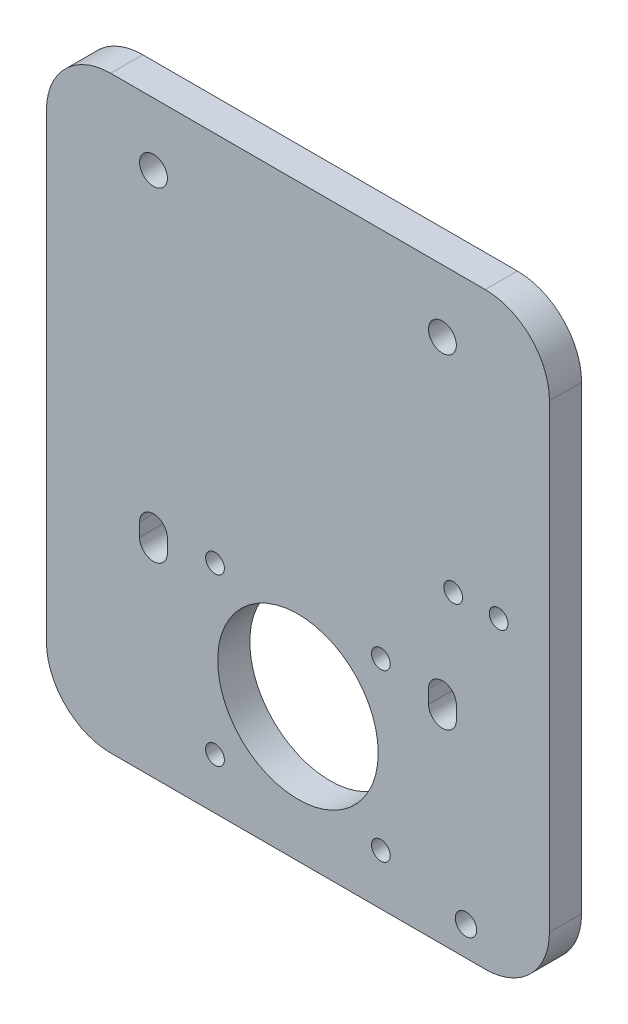
ISO-10303-21;
HEADER;
FILE_DESCRIPTION(('STEP AP214'),'2;1');
FILE_NAME('part.step','',(''),(''),'','','');
FILE_SCHEMA(('AUTOMOTIVE_DESIGN { 1 0 10303 214 1 1 1 1 }'));
ENDSEC;
DATA;
#1=APPLICATION_CONTEXT('core data for automotive mechanical design processes');
#2=APPLICATION_PROTOCOL_DEFINITION('international standard','automotive_design',2000,#1);
#3=PRODUCT_CONTEXT('',#1,'mechanical');
#4=PRODUCT('Part','Part','',(#3));
#5=PRODUCT_RELATED_PRODUCT_CATEGORY('part','',(#4));
#6=PRODUCT_DEFINITION_FORMATION('','',#4);
#7=PRODUCT_DEFINITION_CONTEXT('part definition',#1,'design');
#8=PRODUCT_DEFINITION('design','',#6,#7);
#9=PRODUCT_DEFINITION_SHAPE('','',#8);
#10=(LENGTH_UNIT() NAMED_UNIT(*) SI_UNIT(.MILLI.,.METRE.));
#11=(NAMED_UNIT(*) PLANE_ANGLE_UNIT() SI_UNIT($,.RADIAN.));
#12=(NAMED_UNIT(*) SI_UNIT($,.STERADIAN.) SOLID_ANGLE_UNIT());
#13=UNCERTAINTY_MEASURE_WITH_UNIT(LENGTH_MEASURE(1.E-05),#10,'distance_accuracy_value','');
#14=(GEOMETRIC_REPRESENTATION_CONTEXT(3) GLOBAL_UNCERTAINTY_ASSIGNED_CONTEXT((#13)) GLOBAL_UNIT_ASSIGNED_CONTEXT((#10,
#11,#12)) REPRESENTATION_CONTEXT('',''));
#15=CARTESIAN_POINT('',(0.,0.,0.));
#16=DIRECTION('',(0.,0.,1.));
#17=DIRECTION('',(1.,0.,0.));
#18=AXIS2_PLACEMENT_3D('',#15,#16,#17);
#19=CARTESIAN_POINT('',(27.,37.6,6.));
#20=DIRECTION('',(0.,0.,-1.));
#21=DIRECTION('',(-1.,0.,0.));
#22=AXIS2_PLACEMENT_3D('',#19,#20,#21);
#23=CYLINDRICAL_SURFACE('',#22,2.60000000000222);
#24=CARTESIAN_POINT('',(27.,37.6,0.));
#25=DIRECTION('',(0.,0.,1.));
#26=DIRECTION('',(1.,0.,0.));
#27=AXIS2_PLACEMENT_3D('',#24,#25,#26);
#28=CIRCLE('',#27,2.60000000000222);
#29=CARTESIAN_POINT('',(24.3999999999978,37.6,0.));
#30=VERTEX_POINT('',#29);
#31=CARTESIAN_POINT('',(29.6000000000022,37.6,0.));
#32=VERTEX_POINT('',#31);
#33=EDGE_CURVE('E241',#30,#32,#28,.T.);
#34=ORIENTED_EDGE('',*,*,#33,.F.);
#35=DIRECTION('',(0.,0.,-1.));
#36=VECTOR('',#35,1.);
#37=CARTESIAN_POINT('',(24.3999999999978,37.6,6.));
#38=LINE('',#37,#36);
#39=CARTESIAN_POINT('',(24.3999999999978,37.6,6.));
#40=VERTEX_POINT('',#39);
#41=EDGE_CURVE('E11',#40,#30,#38,.T.);
#42=ORIENTED_EDGE('',*,*,#41,.F.);
#43=CARTESIAN_POINT('',(27.,37.6,6.));
#44=DIRECTION('',(0.,0.,1.));
#45=DIRECTION('',(1.,0.,0.));
#46=AXIS2_PLACEMENT_3D('',#43,#44,#45);
#47=CIRCLE('',#46,2.60000000000222);
#48=CARTESIAN_POINT('',(29.6000000000022,37.6,6.));
#49=VERTEX_POINT('',#48);
#50=EDGE_CURVE('E175',#40,#49,#47,.T.);
#51=ORIENTED_EDGE('',*,*,#50,.T.);
#52=DIRECTION('',(0.,0.,-1.));
#53=VECTOR('',#52,1.);
#54=CARTESIAN_POINT('',(29.6000000000022,37.6,6.));
#55=LINE('',#54,#53);
#56=EDGE_CURVE('E55',#49,#32,#55,.T.);
#57=ORIENTED_EDGE('',*,*,#56,.T.);
#58=EDGE_LOOP('',(#34,#42,#51,#57));
#59=FACE_BOUND('',#58,.T.);
#60=ADVANCED_FACE('F36',(#59),#23,.F.);
#61=CARTESIAN_POINT('',(24.3999999999978,0.,6.));
#62=DIRECTION('',(1.,0.,0.));
#63=DIRECTION('',(0.,0.,-1.));
#64=AXIS2_PLACEMENT_3D('',#61,#62,#63);
#65=PLANE('',#64);
#66=DIRECTION('',(0.,-1.,0.));
#67=VECTOR('',#66,1.);
#68=CARTESIAN_POINT('',(24.3999999999978,0.,0.));
#69=LINE('',#68,#67);
#70=CARTESIAN_POINT('',(24.3999999999978,40.1000000000124,0.));
#71=VERTEX_POINT('',#70);
#72=EDGE_CURVE('E162',#71,#30,#69,.T.);
#73=ORIENTED_EDGE('',*,*,#72,.F.);
#74=DIRECTION('',(0.,0.,-1.));
#75=VECTOR('',#74,1.);
#76=CARTESIAN_POINT('',(24.3999999999978,40.1000000000124,6.));
#77=LINE('',#76,#75);
#78=CARTESIAN_POINT('',(24.3999999999978,40.1000000000124,6.));
#79=VERTEX_POINT('',#78);
#80=EDGE_CURVE('E46',#79,#71,#77,.T.);
#81=ORIENTED_EDGE('',*,*,#80,.F.);
#82=DIRECTION('',(0.,-1.,0.));
#83=VECTOR('',#82,1.);
#84=CARTESIAN_POINT('',(24.3999999999978,0.,6.));
#85=LINE('',#84,#83);
#86=EDGE_CURVE('E160',#79,#40,#85,.T.);
#87=ORIENTED_EDGE('',*,*,#86,.T.);
#88=ORIENTED_EDGE('',*,*,#41,.T.);
#89=EDGE_LOOP('',(#73,#81,#87,#88));
#90=FACE_BOUND('',#89,.T.);
#91=ADVANCED_FACE('F158',(#90),#65,.T.);
#92=CARTESIAN_POINT('',(27.,40.1000000000124,6.));
#93=DIRECTION('',(0.,0.,-1.));
#94=DIRECTION('',(-1.,0.,0.));
#95=AXIS2_PLACEMENT_3D('',#92,#93,#94);
#96=CYLINDRICAL_SURFACE('',#95,2.60000000000222);
#97=CARTESIAN_POINT('',(27.,40.1000000000124,0.));
#98=DIRECTION('',(0.,0.,1.));
#99=DIRECTION('',(1.,0.,0.));
#100=AXIS2_PLACEMENT_3D('',#97,#98,#99);
#101=CIRCLE('',#100,2.60000000000222);
#102=CARTESIAN_POINT('',(29.6000000000022,40.1000000000124,0.));
#103=VERTEX_POINT('',#102);
#104=EDGE_CURVE('E244',#71,#103,#101,.F.);
#105=ORIENTED_EDGE('',*,*,#104,.T.);
#106=DIRECTION('',(0.,0.,-1.));
#107=VECTOR('',#106,1.);
#108=CARTESIAN_POINT('',(29.6000000000022,40.1000000000124,6.));
#109=LINE('',#108,#107);
#110=CARTESIAN_POINT('',(29.6000000000022,40.1000000000124,6.));
#111=VERTEX_POINT('',#110);
#112=EDGE_CURVE('E105',#111,#103,#109,.T.);
#113=ORIENTED_EDGE('',*,*,#112,.F.);
#114=CARTESIAN_POINT('',(27.,40.1000000000124,6.));
#115=DIRECTION('',(0.,0.,1.));
#116=DIRECTION('',(1.,0.,0.));
#117=AXIS2_PLACEMENT_3D('',#114,#115,#116);
#118=CIRCLE('',#117,2.60000000000222);
#119=EDGE_CURVE('E166',#79,#111,#118,.F.);
#120=ORIENTED_EDGE('',*,*,#119,.F.);
#121=ORIENTED_EDGE('',*,*,#80,.T.);
#122=EDGE_LOOP('',(#105,#113,#120,#121));
#123=FACE_BOUND('',#122,.T.);
#124=ADVANCED_FACE('F167',(#123),#96,.F.);
#125=CARTESIAN_POINT('',(-35.,98.,6.));
#126=DIRECTION('',(0.,0.,-1.));
#127=DIRECTION('',(-1.,0.,0.));
#128=AXIS2_PLACEMENT_3D('',#125,#126,#127);
#129=CYLINDRICAL_SURFACE('',#128,12.);
#130=CARTESIAN_POINT('',(-35.,98.,0.));
#131=DIRECTION('',(0.,0.,1.));
#132=DIRECTION('',(1.,0.,0.));
#133=AXIS2_PLACEMENT_3D('',#130,#131,#132);
#134=CIRCLE('',#133,12.);
#135=CARTESIAN_POINT('',(-47.,98.,0.));
#136=VERTEX_POINT('',#135);
#137=CARTESIAN_POINT('',(-35.,110.,0.));
#138=VERTEX_POINT('',#137);
#139=EDGE_CURVE('E208',#136,#138,#134,.F.);
#140=ORIENTED_EDGE('',*,*,#139,.F.);
#141=DIRECTION('',(0.,0.,-1.));
#142=VECTOR('',#141,1.);
#143=CARTESIAN_POINT('',(-47.,98.,6.));
#144=LINE('',#143,#142);
#145=CARTESIAN_POINT('',(-47.,98.,6.));
#146=VERTEX_POINT('',#145);
#147=EDGE_CURVE('E257',#146,#136,#144,.T.);
#148=ORIENTED_EDGE('',*,*,#147,.F.);
#149=CARTESIAN_POINT('',(-35.,98.,6.));
#150=DIRECTION('',(0.,0.,1.));
#151=DIRECTION('',(1.,0.,0.));
#152=AXIS2_PLACEMENT_3D('',#149,#150,#151);
#153=CIRCLE('',#152,12.);
#154=CARTESIAN_POINT('',(-35.,110.,6.));
#155=VERTEX_POINT('',#154);
#156=EDGE_CURVE('E309',#146,#155,#153,.F.);
#157=ORIENTED_EDGE('',*,*,#156,.T.);
#158=DIRECTION('',(0.,0.,-1.));
#159=VECTOR('',#158,1.);
#160=CARTESIAN_POINT('',(-35.,110.,6.));
#161=LINE('',#160,#159);
#162=EDGE_CURVE('E259',#155,#138,#161,.T.);
#163=ORIENTED_EDGE('',*,*,#162,.T.);
#164=EDGE_LOOP('',(#140,#148,#157,#163));
#165=FACE_BOUND('',#164,.T.);
#166=ADVANCED_FACE('F406',(#165),#129,.T.);
#167=CARTESIAN_POINT('',(-47.,0.,6.));
#168=DIRECTION('',(-1.,0.,0.));
#169=DIRECTION('',(0.,-1.,0.));
#170=AXIS2_PLACEMENT_3D('',#167,#168,#169);
#171=PLANE('',#170);
#172=DIRECTION('',(0.,1.,0.));
#173=VECTOR('',#172,1.);
#174=CARTESIAN_POINT('',(-47.,0.,0.));
#175=LINE('',#174,#173);
#176=CARTESIAN_POINT('',(-47.,12.0000000000009,0.));
#177=VERTEX_POINT('',#176);
#178=EDGE_CURVE('E211',#177,#136,#175,.T.);
#179=ORIENTED_EDGE('',*,*,#178,.F.);
#180=DIRECTION('',(0.,0.,-1.));
#181=VECTOR('',#180,1.);
#182=CARTESIAN_POINT('',(-47.,12.0000000000009,6.));
#183=LINE('',#182,#181);
#184=CARTESIAN_POINT('',(-47.,12.0000000000009,6.));
#185=VERTEX_POINT('',#184);
#186=EDGE_CURVE('E271',#185,#177,#183,.T.);
#187=ORIENTED_EDGE('',*,*,#186,.F.);
#188=DIRECTION('',(0.,1.,0.));
#189=VECTOR('',#188,1.);
#190=CARTESIAN_POINT('',(-47.,0.,6.));
#191=LINE('',#190,#189);
#192=EDGE_CURVE('E312',#185,#146,#191,.T.);
#193=ORIENTED_EDGE('',*,*,#192,.T.);
#194=ORIENTED_EDGE('',*,*,#147,.T.);
#195=EDGE_LOOP('',(#179,#187,#193,#194));
#196=FACE_BOUND('',#195,.T.);
#197=ADVANCED_FACE('F402',(#196),#171,.T.);
#198=CARTESIAN_POINT('',(-35.,12.0000000000009,6.));
#199=DIRECTION('',(0.,0.,-1.));
#200=DIRECTION('',(-1.,0.,0.));
#201=AXIS2_PLACEMENT_3D('',#198,#199,#200);
#202=CYLINDRICAL_SURFACE('',#201,12.);
#203=CARTESIAN_POINT('',(-35.,12.0000000000009,0.));
#204=DIRECTION('',(0.,0.,1.));
#205=DIRECTION('',(1.,0.,0.));
#206=AXIS2_PLACEMENT_3D('',#203,#204,#205);
#207=CIRCLE('',#206,12.);
#208=CARTESIAN_POINT('',(-35.,8.88325627822381E-13,0.));
#209=VERTEX_POINT('',#208);
#210=EDGE_CURVE('E214',#177,#209,#207,.T.);
#211=ORIENTED_EDGE('',*,*,#210,.T.);
#212=DIRECTION('',(0.,0.,-1.));
#213=VECTOR('',#212,1.);
#214=CARTESIAN_POINT('',(-35.,8.88325627822381E-13,6.));
#215=LINE('',#214,#213);
#216=CARTESIAN_POINT('',(-35.,8.88325627822381E-13,6.));
#217=VERTEX_POINT('',#216);
#218=EDGE_CURVE('E269',#217,#209,#215,.T.);
#219=ORIENTED_EDGE('',*,*,#218,.F.);
#220=CARTESIAN_POINT('',(-35.,12.0000000000009,6.));
#221=DIRECTION('',(0.,0.,1.));
#222=DIRECTION('',(1.,0.,0.));
#223=AXIS2_PLACEMENT_3D('',#220,#221,#222);
#224=CIRCLE('',#223,12.);
#225=EDGE_CURVE('E315',#185,#217,#224,.T.);
#226=ORIENTED_EDGE('',*,*,#225,.F.);
#227=ORIENTED_EDGE('',*,*,#186,.T.);
#228=EDGE_LOOP('',(#211,#219,#226,#227));
#229=FACE_BOUND('',#228,.T.);
#230=ADVANCED_FACE('F398',(#229),#202,.T.);
#231=CARTESIAN_POINT('',(0.,8.88325627822381E-13,6.));
#232=DIRECTION('',(0.,-1.,0.));
#233=DIRECTION('',(0.,0.,-1.));
#234=AXIS2_PLACEMENT_3D('',#231,#232,#233);
#235=PLANE('',#234);
#236=DIRECTION('',(-1.,0.,0.));
#237=VECTOR('',#236,1.);
#238=CARTESIAN_POINT('',(0.,8.88325627822381E-13,0.));
#239=LINE('',#238,#237);
#240=CARTESIAN_POINT('',(35.,8.88325627822381E-13,0.));
#241=VERTEX_POINT('',#240);
#242=EDGE_CURVE('E217',#241,#209,#239,.T.);
#243=ORIENTED_EDGE('',*,*,#242,.F.);
#244=DIRECTION('',(0.,0.,-1.));
#245=VECTOR('',#244,1.);
#246=CARTESIAN_POINT('',(35.,8.88325627822381E-13,6.));
#247=LINE('',#246,#245);
#248=CARTESIAN_POINT('',(35.,8.88325627822381E-13,6.));
#249=VERTEX_POINT('',#248);
#250=EDGE_CURVE('E267',#249,#241,#247,.T.);
#251=ORIENTED_EDGE('',*,*,#250,.F.);
#252=DIRECTION('',(-1.,0.,0.));
#253=VECTOR('',#252,1.);
#254=CARTESIAN_POINT('',(0.,8.88325627822381E-13,6.));
#255=LINE('',#254,#253);
#256=EDGE_CURVE('E317',#249,#217,#255,.T.);
#257=ORIENTED_EDGE('',*,*,#256,.T.);
#258=ORIENTED_EDGE('',*,*,#218,.T.);
#259=EDGE_LOOP('',(#243,#251,#257,#258));
#260=FACE_BOUND('',#259,.T.);
#261=ADVANCED_FACE('F394',(#260),#235,.T.);
#262=CARTESIAN_POINT('',(35.,12.0000000000009,6.));
#263=DIRECTION('',(0.,0.,-1.));
#264=DIRECTION('',(-1.,0.,0.));
#265=AXIS2_PLACEMENT_3D('',#262,#263,#264);
#266=CYLINDRICAL_SURFACE('',#265,12.);
#267=CARTESIAN_POINT('',(35.,12.0000000000009,0.));
#268=DIRECTION('',(0.,0.,1.));
#269=DIRECTION('',(1.,0.,0.));
#270=AXIS2_PLACEMENT_3D('',#267,#268,#269);
#271=CIRCLE('',#270,12.);
#272=CARTESIAN_POINT('',(47.,12.0000000000009,0.));
#273=VERTEX_POINT('',#272);
#274=EDGE_CURVE('E220',#273,#241,#271,.F.);
#275=ORIENTED_EDGE('',*,*,#274,.F.);
#276=DIRECTION('',(0.,0.,-1.));
#277=VECTOR('',#276,1.);
#278=CARTESIAN_POINT('',(47.,12.0000000000009,6.));
#279=LINE('',#278,#277);
#280=CARTESIAN_POINT('',(47.,12.0000000000009,6.));
#281=VERTEX_POINT('',#280);
#282=EDGE_CURVE('E265',#281,#273,#279,.T.);
#283=ORIENTED_EDGE('',*,*,#282,.F.);
#284=CARTESIAN_POINT('',(35.,12.0000000000009,6.));
#285=DIRECTION('',(0.,0.,1.));
#286=DIRECTION('',(1.,0.,0.));
#287=AXIS2_PLACEMENT_3D('',#284,#285,#286);
#288=CIRCLE('',#287,12.);
#289=EDGE_CURVE('E320',#281,#249,#288,.F.);
#290=ORIENTED_EDGE('',*,*,#289,.T.);
#291=ORIENTED_EDGE('',*,*,#250,.T.);
#292=EDGE_LOOP('',(#275,#283,#290,#291));
#293=FACE_BOUND('',#292,.T.);
#294=ADVANCED_FACE('F390',(#293),#266,.T.);
#295=CARTESIAN_POINT('',(47.,0.,6.));
#296=DIRECTION('',(1.,0.,0.));
#297=DIRECTION('',(0.,0.,-1.));
#298=AXIS2_PLACEMENT_3D('',#295,#296,#297);
#299=PLANE('',#298);
#300=DIRECTION('',(0.,-1.,0.));
#301=VECTOR('',#300,1.);
#302=CARTESIAN_POINT('',(47.,0.,0.));
#303=LINE('',#302,#301);
#304=CARTESIAN_POINT('',(47.,98.,0.));
#305=VERTEX_POINT('',#304);
#306=EDGE_CURVE('E223',#305,#273,#303,.T.);
#307=ORIENTED_EDGE('',*,*,#306,.F.);
#308=DIRECTION('',(0.,0.,-1.));
#309=VECTOR('',#308,1.);
#310=CARTESIAN_POINT('',(47.,98.,6.));
#311=LINE('',#310,#309);
#312=CARTESIAN_POINT('',(47.,98.,6.));
#313=VERTEX_POINT('',#312);
#314=EDGE_CURVE('E263',#313,#305,#311,.T.);
#315=ORIENTED_EDGE('',*,*,#314,.F.);
#316=DIRECTION('',(0.,-1.,0.));
#317=VECTOR('',#316,1.);
#318=CARTESIAN_POINT('',(47.,0.,6.));
#319=LINE('',#318,#317);
#320=EDGE_CURVE('E323',#313,#281,#319,.T.);
#321=ORIENTED_EDGE('',*,*,#320,.T.);
#322=ORIENTED_EDGE('',*,*,#282,.T.);
#323=EDGE_LOOP('',(#307,#315,#321,#322));
#324=FACE_BOUND('',#323,.T.);
#325=ADVANCED_FACE('F386',(#324),#299,.T.);
#326=CARTESIAN_POINT('',(35.,98.,6.));
#327=DIRECTION('',(0.,0.,-1.));
#328=DIRECTION('',(-1.,0.,0.));
#329=AXIS2_PLACEMENT_3D('',#326,#327,#328);
#330=CYLINDRICAL_SURFACE('',#329,12.);
#331=CARTESIAN_POINT('',(35.,98.,0.));
#332=DIRECTION('',(0.,0.,1.));
#333=DIRECTION('',(1.,0.,0.));
#334=AXIS2_PLACEMENT_3D('',#331,#332,#333);
#335=CIRCLE('',#334,12.);
#336=CARTESIAN_POINT('',(35.,110.,0.));
#337=VERTEX_POINT('',#336);
#338=EDGE_CURVE('E226',#337,#305,#335,.F.);
#339=ORIENTED_EDGE('',*,*,#338,.F.);
#340=DIRECTION('',(0.,0.,-1.));
#341=VECTOR('',#340,1.);
#342=CARTESIAN_POINT('',(35.,110.,6.));
#343=LINE('',#342,#341);
#344=CARTESIAN_POINT('',(35.,110.,6.));
#345=VERTEX_POINT('',#344);
#346=EDGE_CURVE('E261',#345,#337,#343,.T.);
#347=ORIENTED_EDGE('',*,*,#346,.F.);
#348=CARTESIAN_POINT('',(35.,98.,6.));
#349=DIRECTION('',(0.,0.,1.));
#350=DIRECTION('',(1.,0.,0.));
#351=AXIS2_PLACEMENT_3D('',#348,#349,#350);
#352=CIRCLE('',#351,12.);
#353=EDGE_CURVE('E326',#345,#313,#352,.F.);
#354=ORIENTED_EDGE('',*,*,#353,.T.);
#355=ORIENTED_EDGE('',*,*,#314,.T.);
#356=EDGE_LOOP('',(#339,#347,#354,#355));
#357=FACE_BOUND('',#356,.T.);
#358=ADVANCED_FACE('F383',(#357),#330,.T.);
#359=CARTESIAN_POINT('',(-27.,40.1000000000124,6.));
#360=DIRECTION('',(0.,0.,-1.));
#361=DIRECTION('',(-1.,0.,0.));
#362=AXIS2_PLACEMENT_3D('',#359,#360,#361);
#363=CYLINDRICAL_SURFACE('',#362,2.60000000000222);
#364=CARTESIAN_POINT('',(-27.,40.1000000000124,0.));
#365=DIRECTION('',(0.,0.,1.));
#366=DIRECTION('',(1.,0.,0.));
#367=AXIS2_PLACEMENT_3D('',#364,#365,#366);
#368=CIRCLE('',#367,2.60000000000222);
#369=CARTESIAN_POINT('',(-24.3999999999978,40.1000000000124,0.));
#370=VERTEX_POINT('',#369);
#371=CARTESIAN_POINT('',(-29.6000000000022,40.1000000000124,0.));
#372=VERTEX_POINT('',#371);
#373=EDGE_CURVE('E189',#370,#372,#368,.T.);
#374=ORIENTED_EDGE('',*,*,#373,.F.);
#375=DIRECTION('',(0.,0.,-1.));
#376=VECTOR('',#375,1.);
#377=CARTESIAN_POINT('',(-24.3999999999978,40.1000000000124,6.));
#378=LINE('',#377,#376);
#379=CARTESIAN_POINT('',(-24.3999999999978,40.1000000000124,6.));
#380=VERTEX_POINT('',#379);
#381=EDGE_CURVE('E40',#380,#370,#378,.T.);
#382=ORIENTED_EDGE('',*,*,#381,.F.);
#383=CARTESIAN_POINT('',(-27.,40.1000000000124,6.));
#384=DIRECTION('',(0.,0.,1.));
#385=DIRECTION('',(1.,0.,0.));
#386=AXIS2_PLACEMENT_3D('',#383,#384,#385);
#387=CIRCLE('',#386,2.60000000000222);
#388=CARTESIAN_POINT('',(-29.6000000000022,40.1000000000124,6.));
#389=VERTEX_POINT('',#388);
#390=EDGE_CURVE('E255',#380,#389,#387,.T.);
#391=ORIENTED_EDGE('',*,*,#390,.T.);
#392=DIRECTION('',(0.,0.,-1.));
#393=VECTOR('',#392,1.);
#394=CARTESIAN_POINT('',(-29.6000000000022,40.1000000000124,6.));
#395=LINE('',#394,#393);
#396=EDGE_CURVE('E188',#389,#372,#395,.T.);
#397=ORIENTED_EDGE('',*,*,#396,.T.);
#398=EDGE_LOOP('',(#374,#382,#391,#397));
#399=FACE_BOUND('',#398,.T.);
#400=ADVANCED_FACE('F38',(#399),#363,.F.);
#401=CARTESIAN_POINT('',(-24.3999999999978,0.,6.));
#402=DIRECTION('',(-1.,0.,0.));
#403=DIRECTION('',(0.,0.,1.));
#404=AXIS2_PLACEMENT_3D('',#401,#402,#403);
#405=PLANE('',#404);
#406=DIRECTION('',(0.,1.,0.));
#407=VECTOR('',#406,1.);
#408=CARTESIAN_POINT('',(-24.3999999999978,0.,0.));
#409=LINE('',#408,#407);
#410=CARTESIAN_POINT('',(-24.3999999999978,37.6,0.));
#411=VERTEX_POINT('',#410);
#412=EDGE_CURVE('E192',#411,#370,#409,.T.);
#413=ORIENTED_EDGE('',*,*,#412,.F.);
#414=DIRECTION('',(0.,0.,-1.));
#415=VECTOR('',#414,1.);
#416=CARTESIAN_POINT('',(-24.3999999999978,37.6,6.));
#417=LINE('',#416,#415);
#418=CARTESIAN_POINT('',(-24.3999999999978,37.6,6.));
#419=VERTEX_POINT('',#418);
#420=EDGE_CURVE('E276',#419,#411,#417,.T.);
#421=ORIENTED_EDGE('',*,*,#420,.F.);
#422=DIRECTION('',(0.,1.,0.));
#423=VECTOR('',#422,1.);
#424=CARTESIAN_POINT('',(-24.3999999999978,0.,6.));
#425=LINE('',#424,#423);
#426=EDGE_CURVE('E285',#419,#380,#425,.T.);
#427=ORIENTED_EDGE('',*,*,#426,.T.);
#428=ORIENTED_EDGE('',*,*,#381,.T.);
#429=EDGE_LOOP('',(#413,#421,#427,#428));
#430=FACE_BOUND('',#429,.T.);
#431=ADVANCED_FACE('F283',(#430),#405,.T.);
#432=CARTESIAN_POINT('',(-27.,37.6,6.));
#433=DIRECTION('',(0.,0.,-1.));
#434=DIRECTION('',(-1.,0.,0.));
#435=AXIS2_PLACEMENT_3D('',#432,#433,#434);
#436=CYLINDRICAL_SURFACE('',#435,2.60000000000222);
#437=CARTESIAN_POINT('',(-27.,37.6,0.));
#438=DIRECTION('',(0.,0.,1.));
#439=DIRECTION('',(1.,0.,0.));
#440=AXIS2_PLACEMENT_3D('',#437,#438,#439);
#441=CIRCLE('',#440,2.60000000000222);
#442=CARTESIAN_POINT('',(-29.6000000000022,37.6,0.));
#443=VERTEX_POINT('',#442);
#444=EDGE_CURVE('E196',#411,#443,#441,.F.);
#445=ORIENTED_EDGE('',*,*,#444,.T.);
#446=DIRECTION('',(0.,0.,-1.));
#447=VECTOR('',#446,1.);
#448=CARTESIAN_POINT('',(-29.6000000000022,37.6,6.));
#449=LINE('',#448,#447);
#450=CARTESIAN_POINT('',(-29.6000000000022,37.6,6.));
#451=VERTEX_POINT('',#450);
#452=EDGE_CURVE('E275',#451,#443,#449,.T.);
#453=ORIENTED_EDGE('',*,*,#452,.F.);
#454=CARTESIAN_POINT('',(-27.,37.6,6.));
#455=DIRECTION('',(0.,0.,1.));
#456=DIRECTION('',(1.,0.,0.));
#457=AXIS2_PLACEMENT_3D('',#454,#455,#456);
#458=CIRCLE('',#457,2.60000000000222);
#459=EDGE_CURVE('E293',#419,#451,#458,.F.);
#460=ORIENTED_EDGE('',*,*,#459,.F.);
#461=ORIENTED_EDGE('',*,*,#420,.T.);
#462=EDGE_LOOP('',(#445,#453,#460,#461));
#463=FACE_BOUND('',#462,.T.);
#464=ADVANCED_FACE('F291',(#463),#436,.F.);
#465=CARTESIAN_POINT('',(27.,98.3000000000124,6.));
#466=DIRECTION('',(0.,0.,-1.));
#467=DIRECTION('',(-1.,0.,0.));
#468=AXIS2_PLACEMENT_3D('',#465,#466,#467);
#469=CYLINDRICAL_SURFACE('',#468,2.6);
#470=CARTESIAN_POINT('',(27.,98.3000000000124,6.));
#471=DIRECTION('',(0.,0.,1.));
#472=DIRECTION('',(1.,0.,0.));
#473=AXIS2_PLACEMENT_3D('',#470,#471,#472);
#474=CIRCLE('',#473,2.6);
#475=CARTESIAN_POINT('',(29.6,98.3000000000124,6.));
#476=VERTEX_POINT('',#475);
#477=EDGE_CURVE('E182',#476,#476,#474,.T.);
#478=ORIENTED_EDGE('',*,*,#477,.T.);
#479=EDGE_LOOP('',(#478));
#480=FACE_BOUND('',#479,.T.);
#481=CARTESIAN_POINT('',(27.,98.3000000000124,0.));
#482=DIRECTION('',(0.,0.,1.));
#483=DIRECTION('',(1.,0.,0.));
#484=AXIS2_PLACEMENT_3D('',#481,#482,#483);
#485=CIRCLE('',#484,2.6);
#486=CARTESIAN_POINT('',(29.6,98.3000000000124,0.));
#487=VERTEX_POINT('',#486);
#488=EDGE_CURVE('E249',#487,#487,#485,.T.);
#489=ORIENTED_EDGE('',*,*,#488,.F.);
#490=EDGE_LOOP('',(#489));
#491=FACE_BOUND('',#490,.T.);
#492=ADVANCED_FACE('F421',(#480,#491),#469,.F.);
#493=CARTESIAN_POINT('',(29.6000000000022,0.,6.));
#494=DIRECTION('',(-1.,0.,0.));
#495=DIRECTION('',(0.,0.,1.));
#496=AXIS2_PLACEMENT_3D('',#493,#494,#495);
#497=PLANE('',#496);
#498=DIRECTION('',(0.,1.,0.));
#499=VECTOR('',#498,1.);
#500=CARTESIAN_POINT('',(29.6000000000022,0.,0.));
#501=LINE('',#500,#499);
#502=EDGE_CURVE('E246',#32,#103,#501,.T.);
#503=ORIENTED_EDGE('',*,*,#502,.F.);
#504=ORIENTED_EDGE('',*,*,#56,.F.);
#505=DIRECTION('',(0.,1.,0.));
#506=VECTOR('',#505,1.);
#507=CARTESIAN_POINT('',(29.6000000000022,0.,6.));
#508=LINE('',#507,#506);
#509=EDGE_CURVE('E170',#49,#111,#508,.T.);
#510=ORIENTED_EDGE('',*,*,#509,.T.);
#511=ORIENTED_EDGE('',*,*,#112,.T.);
#512=EDGE_LOOP('',(#503,#504,#510,#511));
#513=FACE_BOUND('',#512,.T.);
#514=ADVANCED_FACE('F370',(#513),#497,.T.);
#515=CARTESIAN_POINT('',(0.,25.,6.));
#516=DIRECTION('',(0.,0.,-1.));
#517=DIRECTION('',(-1.,0.,0.));
#518=AXIS2_PLACEMENT_3D('',#515,#516,#517);
#519=CYLINDRICAL_SURFACE('',#518,15.);
#520=CARTESIAN_POINT('',(0.,25.,6.));
#521=DIRECTION('',(0.,0.,1.));
#522=DIRECTION('',(1.,0.,0.));
#523=AXIS2_PLACEMENT_3D('',#520,#521,#522);
#524=CIRCLE('',#523,15.);
#525=CARTESIAN_POINT('',(15.,25.,6.));
#526=VERTEX_POINT('',#525);
#527=EDGE_CURVE('E177',#526,#526,#524,.T.);
#528=ORIENTED_EDGE('',*,*,#527,.T.);
#529=EDGE_LOOP('',(#528));
#530=FACE_BOUND('',#529,.T.);
#531=CARTESIAN_POINT('',(0.,25.,0.));
#532=DIRECTION('',(0.,0.,1.));
#533=DIRECTION('',(1.,0.,0.));
#534=AXIS2_PLACEMENT_3D('',#531,#532,#533);
#535=CIRCLE('',#534,15.);
#536=CARTESIAN_POINT('',(15.,25.,0.));
#537=VERTEX_POINT('',#536);
#538=EDGE_CURVE('E238',#537,#537,#535,.T.);
#539=ORIENTED_EDGE('',*,*,#538,.F.);
#540=EDGE_LOOP('',(#539));
#541=FACE_BOUND('',#540,.T.);
#542=ADVANCED_FACE('F340',(#530,#541),#519,.F.);
#543=CARTESIAN_POINT('',(15.5,40.5,6.));
#544=DIRECTION('',(0.,0.,-1.));
#545=DIRECTION('',(-1.,0.,0.));
#546=AXIS2_PLACEMENT_3D('',#543,#544,#545);
#547=CYLINDRICAL_SURFACE('',#546,1.75);
#548=CARTESIAN_POINT('',(15.5,40.5,6.));
#549=DIRECTION('',(0.,0.,1.));
#550=DIRECTION('',(1.,0.,0.));
#551=AXIS2_PLACEMENT_3D('',#548,#549,#550);
#552=CIRCLE('',#551,1.75);
#553=CARTESIAN_POINT('',(17.25,40.5,6.));
#554=VERTEX_POINT('',#553);
#555=EDGE_CURVE('E335',#554,#554,#552,.F.);
#556=ORIENTED_EDGE('',*,*,#555,.F.);
#557=EDGE_LOOP('',(#556));
#558=FACE_BOUND('',#557,.T.);
#559=CARTESIAN_POINT('',(15.5,40.5,0.));
#560=DIRECTION('',(0.,0.,1.));
#561=DIRECTION('',(1.,0.,0.));
#562=AXIS2_PLACEMENT_3D('',#559,#560,#561);
#563=CIRCLE('',#562,1.75);
#564=CARTESIAN_POINT('',(17.25,40.5,0.));
#565=VERTEX_POINT('',#564);
#566=EDGE_CURVE('E235',#565,#565,#563,.F.);
#567=ORIENTED_EDGE('',*,*,#566,.T.);
#568=EDGE_LOOP('',(#567));
#569=FACE_BOUND('',#568,.T.);
#570=ADVANCED_FACE('F369',(#558,#569),#547,.F.);
#571=CARTESIAN_POINT('',(15.5,9.49999999999999,6.));
#572=DIRECTION('',(0.,0.,-1.));
#573=DIRECTION('',(-1.,0.,0.));
#574=AXIS2_PLACEMENT_3D('',#571,#572,#573);
#575=CYLINDRICAL_SURFACE('',#574,1.75);
#576=CARTESIAN_POINT('',(15.5,9.49999999999999,6.));
#577=DIRECTION('',(0.,0.,1.));
#578=DIRECTION('',(1.,0.,0.));
#579=AXIS2_PLACEMENT_3D('',#576,#577,#578);
#580=CIRCLE('',#579,1.75);
#581=CARTESIAN_POINT('',(17.25,9.49999999999999,6.));
#582=VERTEX_POINT('',#581);
#583=EDGE_CURVE('E332',#582,#582,#580,.T.);
#584=ORIENTED_EDGE('',*,*,#583,.T.);
#585=EDGE_LOOP('',(#584));
#586=FACE_BOUND('',#585,.T.);
#587=CARTESIAN_POINT('',(15.5,9.49999999999999,0.));
#588=DIRECTION('',(0.,0.,1.));
#589=DIRECTION('',(1.,0.,0.));
#590=AXIS2_PLACEMENT_3D('',#587,#588,#589);
#591=CIRCLE('',#590,1.75);
#592=CARTESIAN_POINT('',(17.25,9.49999999999999,0.));
#593=VERTEX_POINT('',#592);
#594=EDGE_CURVE('E232',#593,#593,#591,.T.);
#595=ORIENTED_EDGE('',*,*,#594,.F.);
#596=EDGE_LOOP('',(#595));
#597=FACE_BOUND('',#596,.T.);
#598=ADVANCED_FACE('F373',(#586,#597),#575,.F.);
#599=CARTESIAN_POINT('',(0.,110.,6.));
#600=DIRECTION('',(0.,1.,0.));
#601=DIRECTION('',(0.,0.,1.));
#602=AXIS2_PLACEMENT_3D('',#599,#600,#601);
#603=PLANE('',#602);
#604=DIRECTION('',(1.,0.,0.));
#605=VECTOR('',#604,1.);
#606=CARTESIAN_POINT('',(0.,110.,0.));
#607=LINE('',#606,#605);
#608=EDGE_CURVE('E229',#138,#337,#607,.T.);
#609=ORIENTED_EDGE('',*,*,#608,.F.);
#610=ORIENTED_EDGE('',*,*,#162,.F.);
#611=DIRECTION('',(1.,0.,0.));
#612=VECTOR('',#611,1.);
#613=CARTESIAN_POINT('',(0.,110.,6.));
#614=LINE('',#613,#612);
#615=EDGE_CURVE('E329',#155,#345,#614,.T.);
#616=ORIENTED_EDGE('',*,*,#615,.T.);
#617=ORIENTED_EDGE('',*,*,#346,.T.);
#618=EDGE_LOOP('',(#609,#610,#616,#617));
#619=FACE_BOUND('',#618,.T.);
#620=ADVANCED_FACE('F377',(#619),#603,.T.);
#621=CARTESIAN_POINT('',(-15.5,40.5,6.));
#622=DIRECTION('',(0.,0.,-1.));
#623=DIRECTION('',(-1.,0.,0.));
#624=AXIS2_PLACEMENT_3D('',#621,#622,#623);
#625=CYLINDRICAL_SURFACE('',#624,1.75);
#626=CARTESIAN_POINT('',(-15.5,40.5,6.));
#627=DIRECTION('',(0.,0.,1.));
#628=DIRECTION('',(1.,0.,0.));
#629=AXIS2_PLACEMENT_3D('',#626,#627,#628);
#630=CIRCLE('',#629,1.75);
#631=CARTESIAN_POINT('',(-13.75,40.5,6.));
#632=VERTEX_POINT('',#631);
#633=EDGE_CURVE('E302',#632,#632,#630,.T.);
#634=ORIENTED_EDGE('',*,*,#633,.T.);
#635=EDGE_LOOP('',(#634));
#636=FACE_BOUND('',#635,.T.);
#637=CARTESIAN_POINT('',(-15.5,40.5,0.));
#638=DIRECTION('',(0.,0.,1.));
#639=DIRECTION('',(1.,0.,0.));
#640=AXIS2_PLACEMENT_3D('',#637,#638,#639);
#641=CIRCLE('',#640,1.75);
#642=CARTESIAN_POINT('',(-13.75,40.5,0.));
#643=VERTEX_POINT('',#642);
#644=EDGE_CURVE('E205',#643,#643,#641,.T.);
#645=ORIENTED_EDGE('',*,*,#644,.F.);
#646=EDGE_LOOP('',(#645));
#647=FACE_BOUND('',#646,.T.);
#648=ADVANCED_FACE('F381',(#636,#647),#625,.F.);
#649=CARTESIAN_POINT('',(-15.5,9.49999999999998,6.));
#650=DIRECTION('',(0.,0.,-1.));
#651=DIRECTION('',(-1.,0.,0.));
#652=AXIS2_PLACEMENT_3D('',#649,#650,#651);
#653=CYLINDRICAL_SURFACE('',#652,1.75);
#654=CARTESIAN_POINT('',(-15.5,9.49999999999998,6.));
#655=DIRECTION('',(0.,0.,1.));
#656=DIRECTION('',(1.,0.,0.));
#657=AXIS2_PLACEMENT_3D('',#654,#655,#656);
#658=CIRCLE('',#657,1.75);
#659=CARTESIAN_POINT('',(-13.75,9.49999999999998,6.));
#660=VERTEX_POINT('',#659);
#661=EDGE_CURVE('E299',#660,#660,#658,.F.);
#662=ORIENTED_EDGE('',*,*,#661,.F.);
#663=EDGE_LOOP('',(#662));
#664=FACE_BOUND('',#663,.T.);
#665=CARTESIAN_POINT('',(-15.5,9.49999999999998,0.));
#666=DIRECTION('',(0.,0.,1.));
#667=DIRECTION('',(1.,0.,0.));
#668=AXIS2_PLACEMENT_3D('',#665,#666,#667);
#669=CIRCLE('',#668,1.75);
#670=CARTESIAN_POINT('',(-13.75,9.49999999999998,0.));
#671=VERTEX_POINT('',#670);
#672=EDGE_CURVE('E202',#671,#671,#669,.F.);
#673=ORIENTED_EDGE('',*,*,#672,.T.);
#674=EDGE_LOOP('',(#673));
#675=FACE_BOUND('',#674,.T.);
#676=ADVANCED_FACE('F413',(#664,#675),#653,.F.);
#677=CARTESIAN_POINT('',(-29.6000000000022,0.,6.));
#678=DIRECTION('',(1.,0.,0.));
#679=DIRECTION('',(0.,0.,-1.));
#680=AXIS2_PLACEMENT_3D('',#677,#678,#679);
#681=PLANE('',#680);
#682=DIRECTION('',(0.,-1.,0.));
#683=VECTOR('',#682,1.);
#684=CARTESIAN_POINT('',(-29.6000000000022,0.,0.));
#685=LINE('',#684,#683);
#686=EDGE_CURVE('E199',#372,#443,#685,.T.);
#687=ORIENTED_EDGE('',*,*,#686,.F.);
#688=ORIENTED_EDGE('',*,*,#396,.F.);
#689=DIRECTION('',(0.,-1.,0.));
#690=VECTOR('',#689,1.);
#691=CARTESIAN_POINT('',(-29.6000000000022,0.,6.));
#692=LINE('',#691,#690);
#693=EDGE_CURVE('E296',#389,#451,#692,.T.);
#694=ORIENTED_EDGE('',*,*,#693,.T.);
#695=ORIENTED_EDGE('',*,*,#452,.T.);
#696=EDGE_LOOP('',(#687,#688,#694,#695));
#697=FACE_BOUND('',#696,.T.);
#698=ADVANCED_FACE('F297',(#697),#681,.T.);
#699=CARTESIAN_POINT('',(-27.,98.3000000000124,6.));
#700=DIRECTION('',(0.,0.,-1.));
#701=DIRECTION('',(-1.,0.,0.));
#702=AXIS2_PLACEMENT_3D('',#699,#700,#701);
#703=CYLINDRICAL_SURFACE('',#702,2.6);
#704=CARTESIAN_POINT('',(-27.,98.3000000000124,6.));
#705=DIRECTION('',(0.,0.,1.));
#706=DIRECTION('',(1.,0.,0.));
#707=AXIS2_PLACEMENT_3D('',#704,#705,#706);
#708=CIRCLE('',#707,2.6);
#709=CARTESIAN_POINT('',(-24.4,98.3000000000124,6.));
#710=VERTEX_POINT('',#709);
#711=EDGE_CURVE('E185',#710,#710,#708,.F.);
#712=ORIENTED_EDGE('',*,*,#711,.F.);
#713=EDGE_LOOP('',(#712));
#714=FACE_BOUND('',#713,.T.);
#715=CARTESIAN_POINT('',(-27.,98.3000000000124,0.));
#716=DIRECTION('',(0.,0.,1.));
#717=DIRECTION('',(1.,0.,0.));
#718=AXIS2_PLACEMENT_3D('',#715,#716,#717);
#719=CIRCLE('',#718,2.6);
#720=CARTESIAN_POINT('',(-24.4,98.3000000000124,0.));
#721=VERTEX_POINT('',#720);
#722=EDGE_CURVE('E252',#721,#721,#719,.F.);
#723=ORIENTED_EDGE('',*,*,#722,.T.);
#724=EDGE_LOOP('',(#723));
#725=FACE_BOUND('',#724,.T.);
#726=ADVANCED_FACE('F344',(#714,#725),#703,.F.);
#727=CARTESIAN_POINT('',(0.,0.,6.));
#728=DIRECTION('',(0.,0.,1.));
#729=DIRECTION('',(1.,0.,0.));
#730=AXIS2_PLACEMENT_3D('',#727,#728,#729);
#731=PLANE('',#730);
#732=CARTESIAN_POINT('',(31.3948279870499,5.50571160050231,6.));
#733=DIRECTION('',(0.,0.,1.));
#734=DIRECTION('',(1.,0.,0.));
#735=AXIS2_PLACEMENT_3D('',#732,#733,#734);
#736=CIRCLE('',#735,2.);
#737=CARTESIAN_POINT('',(33.3948279870499,5.50571160050231,6.));
#738=VERTEX_POINT('',#737);
#739=EDGE_CURVE('E610',#738,#738,#736,.T.);
#740=ORIENTED_EDGE('',*,*,#739,.F.);
#741=EDGE_LOOP('',(#740));
#742=FACE_BOUND('',#741,.T.);
#743=CARTESIAN_POINT('',(37.5,58.0000000000009,6.));
#744=DIRECTION('',(0.,0.,1.));
#745=DIRECTION('',(1.,0.,0.));
#746=AXIS2_PLACEMENT_3D('',#743,#744,#745);
#747=CIRCLE('',#746,1.75);
#748=CARTESIAN_POINT('',(39.25,58.0000000000009,6.));
#749=VERTEX_POINT('',#748);
#750=EDGE_CURVE('E617',#749,#749,#747,.T.);
#751=ORIENTED_EDGE('',*,*,#750,.F.);
#752=EDGE_LOOP('',(#751));
#753=FACE_BOUND('',#752,.T.);
#754=CARTESIAN_POINT('',(29.,58.0000000000009,6.));
#755=DIRECTION('',(0.,0.,1.));
#756=DIRECTION('',(1.,0.,0.));
#757=AXIS2_PLACEMENT_3D('',#754,#755,#756);
#758=CIRCLE('',#757,1.75);
#759=CARTESIAN_POINT('',(30.75,58.0000000000009,6.));
#760=VERTEX_POINT('',#759);
#761=EDGE_CURVE('E193',#760,#760,#758,.T.);
#762=ORIENTED_EDGE('',*,*,#761,.F.);
#763=EDGE_LOOP('',(#762));
#764=FACE_BOUND('',#763,.T.);
#765=ORIENTED_EDGE('',*,*,#390,.F.);
#766=ORIENTED_EDGE('',*,*,#426,.F.);
#767=ORIENTED_EDGE('',*,*,#459,.T.);
#768=ORIENTED_EDGE('',*,*,#693,.F.);
#769=EDGE_LOOP('',(#765,#766,#767,#768));
#770=FACE_BOUND('',#769,.T.);
#771=ORIENTED_EDGE('',*,*,#661,.T.);
#772=EDGE_LOOP('',(#771));
#773=FACE_BOUND('',#772,.T.);
#774=ORIENTED_EDGE('',*,*,#633,.F.);
#775=EDGE_LOOP('',(#774));
#776=FACE_BOUND('',#775,.T.);
#777=ORIENTED_EDGE('',*,*,#156,.F.);
#778=ORIENTED_EDGE('',*,*,#192,.F.);
#779=ORIENTED_EDGE('',*,*,#225,.T.);
#780=ORIENTED_EDGE('',*,*,#256,.F.);
#781=ORIENTED_EDGE('',*,*,#289,.F.);
#782=ORIENTED_EDGE('',*,*,#320,.F.);
#783=ORIENTED_EDGE('',*,*,#353,.F.);
#784=ORIENTED_EDGE('',*,*,#615,.F.);
#785=EDGE_LOOP('',(#777,#778,#779,#780,#781,#782,#783,#784));
#786=FACE_BOUND('',#785,.T.);
#787=ORIENTED_EDGE('',*,*,#583,.F.);
#788=EDGE_LOOP('',(#787));
#789=FACE_BOUND('',#788,.T.);
#790=ORIENTED_EDGE('',*,*,#555,.T.);
#791=EDGE_LOOP('',(#790));
#792=FACE_BOUND('',#791,.T.);
#793=ORIENTED_EDGE('',*,*,#527,.F.);
#794=EDGE_LOOP('',(#793));
#795=FACE_BOUND('',#794,.T.);
#796=ORIENTED_EDGE('',*,*,#50,.F.);
#797=ORIENTED_EDGE('',*,*,#86,.F.);
#798=ORIENTED_EDGE('',*,*,#119,.T.);
#799=ORIENTED_EDGE('',*,*,#509,.F.);
#800=EDGE_LOOP('',(#796,#797,#798,#799));
#801=FACE_BOUND('',#800,.T.);
#802=ORIENTED_EDGE('',*,*,#477,.F.);
#803=EDGE_LOOP('',(#802));
#804=FACE_BOUND('',#803,.T.);
#805=ORIENTED_EDGE('',*,*,#711,.T.);
#806=EDGE_LOOP('',(#805));
#807=FACE_BOUND('',#806,.T.);
#808=ADVANCED_FACE('F173',(#742,#753,#764,#770,#773,#776,#786,#789,#792,#795,#801,#804,#807),
#731,.T.);
#809=CARTESIAN_POINT('',(0.,0.,0.));
#810=DIRECTION('',(0.,0.,1.));
#811=DIRECTION('',(1.,0.,0.));
#812=AXIS2_PLACEMENT_3D('',#809,#810,#811);
#813=PLANE('',#812);
#814=CARTESIAN_POINT('',(31.3948279870499,5.50571160050231,0.));
#815=DIRECTION('',(0.,0.,1.));
#816=DIRECTION('',(1.,0.,0.));
#817=AXIS2_PLACEMENT_3D('',#814,#815,#816);
#818=CIRCLE('',#817,2.);
#819=CARTESIAN_POINT('',(33.3948279870499,5.50571160050231,0.));
#820=VERTEX_POINT('',#819);
#821=EDGE_CURVE('E608',#820,#820,#818,.T.);
#822=ORIENTED_EDGE('',*,*,#821,.T.);
#823=EDGE_LOOP('',(#822));
#824=FACE_BOUND('',#823,.T.);
#825=CARTESIAN_POINT('',(37.5,58.0000000000009,0.));
#826=DIRECTION('',(0.,0.,-1.));
#827=DIRECTION('',(-1.,0.,0.));
#828=AXIS2_PLACEMENT_3D('',#825,#826,#827);
#829=CIRCLE('',#828,1.75);
#830=CARTESIAN_POINT('',(35.75,58.0000000000009,0.));
#831=VERTEX_POINT('',#830);
#832=EDGE_CURVE('E612',#831,#831,#829,.T.);
#833=ORIENTED_EDGE('',*,*,#832,.F.);
#834=EDGE_LOOP('',(#833));
#835=FACE_BOUND('',#834,.T.);
#836=CARTESIAN_POINT('',(29.,58.0000000000009,0.));
#837=DIRECTION('',(0.,0.,-1.));
#838=DIRECTION('',(-1.,0.,0.));
#839=AXIS2_PLACEMENT_3D('',#836,#837,#838);
#840=CIRCLE('',#839,1.75);
#841=CARTESIAN_POINT('',(27.25,58.0000000000009,0.));
#842=VERTEX_POINT('',#841);
#843=EDGE_CURVE('E620',#842,#842,#840,.T.);
#844=ORIENTED_EDGE('',*,*,#843,.F.);
#845=EDGE_LOOP('',(#844));
#846=FACE_BOUND('',#845,.T.);
#847=ORIENTED_EDGE('',*,*,#373,.T.);
#848=ORIENTED_EDGE('',*,*,#686,.T.);
#849=ORIENTED_EDGE('',*,*,#444,.F.);
#850=ORIENTED_EDGE('',*,*,#412,.T.);
#851=EDGE_LOOP('',(#847,#848,#849,#850));
#852=FACE_BOUND('',#851,.T.);
#853=ORIENTED_EDGE('',*,*,#672,.F.);
#854=EDGE_LOOP('',(#853));
#855=FACE_BOUND('',#854,.T.);
#856=ORIENTED_EDGE('',*,*,#644,.T.);
#857=EDGE_LOOP('',(#856));
#858=FACE_BOUND('',#857,.T.);
#859=ORIENTED_EDGE('',*,*,#139,.T.);
#860=ORIENTED_EDGE('',*,*,#608,.T.);
#861=ORIENTED_EDGE('',*,*,#338,.T.);
#862=ORIENTED_EDGE('',*,*,#306,.T.);
#863=ORIENTED_EDGE('',*,*,#274,.T.);
#864=ORIENTED_EDGE('',*,*,#242,.T.);
#865=ORIENTED_EDGE('',*,*,#210,.F.);
#866=ORIENTED_EDGE('',*,*,#178,.T.);
#867=EDGE_LOOP('',(#859,#860,#861,#862,#863,#864,#865,#866));
#868=FACE_BOUND('',#867,.T.);
#869=ORIENTED_EDGE('',*,*,#594,.T.);
#870=EDGE_LOOP('',(#869));
#871=FACE_BOUND('',#870,.T.);
#872=ORIENTED_EDGE('',*,*,#566,.F.);
#873=EDGE_LOOP('',(#872));
#874=FACE_BOUND('',#873,.T.);
#875=ORIENTED_EDGE('',*,*,#538,.T.);
#876=EDGE_LOOP('',(#875));
#877=FACE_BOUND('',#876,.T.);
#878=ORIENTED_EDGE('',*,*,#33,.T.);
#879=ORIENTED_EDGE('',*,*,#502,.T.);
#880=ORIENTED_EDGE('',*,*,#104,.F.);
#881=ORIENTED_EDGE('',*,*,#72,.T.);
#882=EDGE_LOOP('',(#878,#879,#880,#881));
#883=FACE_BOUND('',#882,.T.);
#884=ORIENTED_EDGE('',*,*,#488,.T.);
#885=EDGE_LOOP('',(#884));
#886=FACE_BOUND('',#885,.T.);
#887=ORIENTED_EDGE('',*,*,#722,.F.);
#888=EDGE_LOOP('',(#887));
#889=FACE_BOUND('',#888,.T.);
#890=ADVANCED_FACE('F288',(#824,#835,#846,#852,#855,#858,#868,#871,#874,#877,#883,#886,#889),
#813,.F.);
#891=CARTESIAN_POINT('',(29.,58.0000000000009,10.));
#892=DIRECTION('',(0.,0.,-1.));
#893=DIRECTION('',(-1.,0.,0.));
#894=AXIS2_PLACEMENT_3D('',#891,#892,#893);
#895=CYLINDRICAL_SURFACE('',#894,1.75);
#896=ORIENTED_EDGE('',*,*,#761,.T.);
#897=EDGE_LOOP('',(#896));
#898=FACE_BOUND('',#897,.T.);
#899=ORIENTED_EDGE('',*,*,#843,.T.);
#900=EDGE_LOOP('',(#899));
#901=FACE_BOUND('',#900,.T.);
#902=ADVANCED_FACE('F351',(#898,#901),#895,.F.);
#903=CARTESIAN_POINT('',(37.5,58.0000000000009,10.));
#904=DIRECTION('',(0.,0.,-1.));
#905=DIRECTION('',(-1.,0.,0.));
#906=AXIS2_PLACEMENT_3D('',#903,#904,#905);
#907=CYLINDRICAL_SURFACE('',#906,1.75);
#908=ORIENTED_EDGE('',*,*,#750,.T.);
#909=EDGE_LOOP('',(#908));
#910=FACE_BOUND('',#909,.T.);
#911=ORIENTED_EDGE('',*,*,#832,.T.);
#912=EDGE_LOOP('',(#911));
#913=FACE_BOUND('',#912,.T.);
#914=ADVANCED_FACE('F584',(#910,#913),#907,.F.);
#915=CARTESIAN_POINT('',(31.3948279870499,5.50571160050231,0.));
#916=DIRECTION('',(0.,0.,1.));
#917=DIRECTION('',(1.,0.,0.));
#918=AXIS2_PLACEMENT_3D('',#915,#916,#917);
#919=CYLINDRICAL_SURFACE('',#918,2.);
#920=ORIENTED_EDGE('',*,*,#821,.F.);
#921=EDGE_LOOP('',(#920));
#922=FACE_BOUND('',#921,.T.);
#923=ORIENTED_EDGE('',*,*,#739,.T.);
#924=EDGE_LOOP('',(#923));
#925=FACE_BOUND('',#924,.T.);
#926=ADVANCED_FACE('F591',(#922,#925),#919,.F.);
#927=CLOSED_SHELL('',(#60,#91,#124,#166,#197,#230,#261,#294,#325,#358,#400,#431,#464,#492,#514,
#542,#570,#598,#620,#648,#676,#698,#726,#808,#890,#902,#914,#926));
#928=MANIFOLD_SOLID_BREP('B2',#927);
#929=ADVANCED_BREP_SHAPE_REPRESENTATION('',(#18,#928),#14);
#930=SHAPE_DEFINITION_REPRESENTATION(#9,#929);
ENDSEC;
END-ISO-10303-21;
